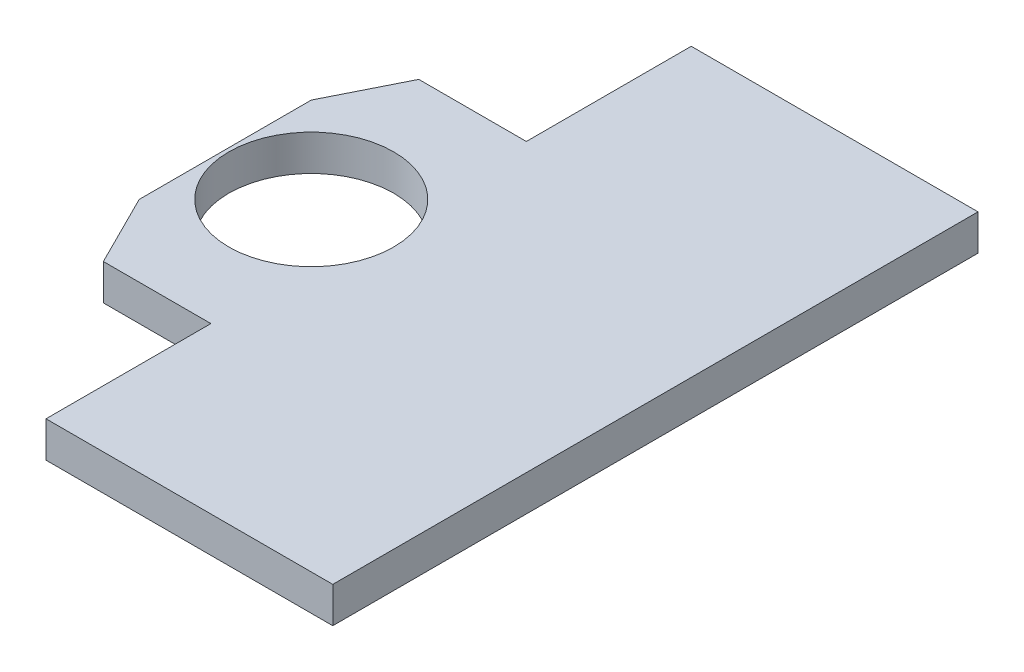
ISO-10303-21;
HEADER;
FILE_DESCRIPTION(('STEP AP214'),'2;1');
FILE_NAME('part.step','',(''),(''),'','','');
FILE_SCHEMA(('AUTOMOTIVE_DESIGN { 1 0 10303 214 1 1 1 1 }'));
ENDSEC;
DATA;
#1=APPLICATION_CONTEXT('core data for automotive mechanical design processes');
#2=APPLICATION_PROTOCOL_DEFINITION('international standard','automotive_design',2000,#1);
#3=PRODUCT_CONTEXT('',#1,'mechanical');
#4=PRODUCT('Part','Part','',(#3));
#5=PRODUCT_RELATED_PRODUCT_CATEGORY('part','',(#4));
#6=PRODUCT_DEFINITION_FORMATION('','',#4);
#7=PRODUCT_DEFINITION_CONTEXT('part definition',#1,'design');
#8=PRODUCT_DEFINITION('design','',#6,#7);
#9=PRODUCT_DEFINITION_SHAPE('','',#8);
#10=(LENGTH_UNIT() NAMED_UNIT(*) SI_UNIT(.MILLI.,.METRE.));
#11=(NAMED_UNIT(*) PLANE_ANGLE_UNIT() SI_UNIT($,.RADIAN.));
#12=(NAMED_UNIT(*) SI_UNIT($,.STERADIAN.) SOLID_ANGLE_UNIT());
#13=UNCERTAINTY_MEASURE_WITH_UNIT(LENGTH_MEASURE(1.E-05),#10,'distance_accuracy_value','');
#14=(GEOMETRIC_REPRESENTATION_CONTEXT(3) GLOBAL_UNCERTAINTY_ASSIGNED_CONTEXT((#13)) GLOBAL_UNIT_ASSIGNED_CONTEXT((#10,
#11,#12)) REPRESENTATION_CONTEXT('',''));
#15=CARTESIAN_POINT('',(0.,0.,0.));
#16=DIRECTION('',(0.,0.,1.));
#17=DIRECTION('',(1.,0.,0.));
#18=AXIS2_PLACEMENT_3D('',#15,#16,#17);
#19=CARTESIAN_POINT('',(0.,6.35,0.));
#20=DIRECTION('',(0.,1.,0.));
#21=DIRECTION('',(0.,0.,1.));
#22=AXIS2_PLACEMENT_3D('',#19,#20,#21);
#23=PLANE('',#22);
#24=DIRECTION('',(0.447213595499958,0.,-0.894427190999916));
#25=VECTOR('',#24,1.);
#26=CARTESIAN_POINT('',(-38.1,6.35,-15.24));
#27=LINE('',#26,#25);
#28=CARTESIAN_POINT('',(-38.1,6.35,-15.24));
#29=VERTEX_POINT('',#28);
#30=CARTESIAN_POINT('',(-31.75,6.35,-27.94));
#31=VERTEX_POINT('',#30);
#32=EDGE_CURVE('E48',#29,#31,#27,.T.);
#33=ORIENTED_EDGE('',*,*,#32,.F.);
#34=DIRECTION('',(0.,0.,1.));
#35=VECTOR('',#34,1.);
#36=CARTESIAN_POINT('',(-38.1,6.35,-57.15));
#37=LINE('',#36,#35);
#38=CARTESIAN_POINT('',(-38.1,6.35,15.24));
#39=VERTEX_POINT('',#38);
#40=EDGE_CURVE('E151',#29,#39,#37,.T.);
#41=ORIENTED_EDGE('',*,*,#40,.T.);
#42=DIRECTION('',(-0.447213595499958,0.,-0.894427190999916));
#43=VECTOR('',#42,1.);
#44=CARTESIAN_POINT('',(-31.75,6.35,27.94));
#45=LINE('',#44,#43);
#46=CARTESIAN_POINT('',(-31.75,6.35,27.94));
#47=VERTEX_POINT('',#46);
#48=EDGE_CURVE('E212',#47,#39,#45,.T.);
#49=ORIENTED_EDGE('',*,*,#48,.F.);
#50=DIRECTION('',(-1.,0.,0.));
#51=VECTOR('',#50,1.);
#52=CARTESIAN_POINT('',(-38.1,6.35,27.94));
#53=LINE('',#52,#51);
#54=CARTESIAN_POINT('',(-12.7,6.35,27.94));
#55=VERTEX_POINT('',#54);
#56=EDGE_CURVE('E186',#55,#47,#53,.T.);
#57=ORIENTED_EDGE('',*,*,#56,.F.);
#58=DIRECTION('',(0.,0.,-1.));
#59=VECTOR('',#58,1.);
#60=CARTESIAN_POINT('',(-12.7,6.35,27.94));
#61=LINE('',#60,#59);
#62=CARTESIAN_POINT('',(-12.7,6.35,57.15));
#63=VERTEX_POINT('',#62);
#64=EDGE_CURVE('E180',#63,#55,#61,.T.);
#65=ORIENTED_EDGE('',*,*,#64,.F.);
#66=DIRECTION('',(1.,0.,0.));
#67=VECTOR('',#66,1.);
#68=CARTESIAN_POINT('',(-38.1,6.35,57.15));
#69=LINE('',#68,#67);
#70=CARTESIAN_POINT('',(38.1,6.35,57.15));
#71=VERTEX_POINT('',#70);
#72=EDGE_CURVE('E153',#63,#71,#69,.T.);
#73=ORIENTED_EDGE('',*,*,#72,.T.);
#74=DIRECTION('',(0.,0.,-1.));
#75=VECTOR('',#74,1.);
#76=CARTESIAN_POINT('',(38.1,6.35,-57.15));
#77=LINE('',#76,#75);
#78=CARTESIAN_POINT('',(38.1,6.35,-57.15));
#79=VERTEX_POINT('',#78);
#80=EDGE_CURVE('E144',#71,#79,#77,.T.);
#81=ORIENTED_EDGE('',*,*,#80,.T.);
#82=DIRECTION('',(-1.,0.,0.));
#83=VECTOR('',#82,1.);
#84=CARTESIAN_POINT('',(-38.1,6.35,-57.15));
#85=LINE('',#84,#83);
#86=CARTESIAN_POINT('',(-12.7,6.35,-57.15));
#87=VERTEX_POINT('',#86);
#88=EDGE_CURVE('E147',#79,#87,#85,.T.);
#89=ORIENTED_EDGE('',*,*,#88,.T.);
#90=DIRECTION('',(0.,0.,-1.));
#91=VECTOR('',#90,1.);
#92=CARTESIAN_POINT('',(-12.7,6.35,-57.15));
#93=LINE('',#92,#91);
#94=CARTESIAN_POINT('',(-12.7,6.35,-27.94));
#95=VERTEX_POINT('',#94);
#96=EDGE_CURVE('E197',#95,#87,#93,.T.);
#97=ORIENTED_EDGE('',*,*,#96,.F.);
#98=DIRECTION('',(1.,0.,0.));
#99=VECTOR('',#98,1.);
#100=CARTESIAN_POINT('',(-12.7,6.35,-27.94));
#101=LINE('',#100,#99);
#102=EDGE_CURVE('E195',#31,#95,#101,.T.);
#103=ORIENTED_EDGE('',*,*,#102,.F.);
#104=EDGE_LOOP('',(#33,#41,#49,#57,#65,#73,#81,#89,#97,#103));
#105=FACE_BOUND('',#104,.T.);
#106=CARTESIAN_POINT('',(-22.86,6.35,0.));
#107=DIRECTION('',(0.,1.,0.));
#108=DIRECTION('',(0.,0.,1.));
#109=AXIS2_PLACEMENT_3D('',#106,#107,#108);
#110=CIRCLE('',#109,14.605);
#111=CARTESIAN_POINT('',(-22.86,6.35,14.605));
#112=VERTEX_POINT('',#111);
#113=EDGE_CURVE('E135',#112,#112,#110,.T.);
#114=ORIENTED_EDGE('',*,*,#113,.F.);
#115=EDGE_LOOP('',(#114));
#116=FACE_BOUND('',#115,.T.);
#117=ADVANCED_FACE('F33',(#105,#116),#23,.T.);
#118=CARTESIAN_POINT('',(0.,0.,0.));
#119=DIRECTION('',(0.,1.,0.));
#120=DIRECTION('',(0.,0.,1.));
#121=AXIS2_PLACEMENT_3D('',#118,#119,#120);
#122=PLANE('',#121);
#123=DIRECTION('',(0.,0.,1.));
#124=VECTOR('',#123,1.);
#125=CARTESIAN_POINT('',(-38.1,0.,-57.15));
#126=LINE('',#125,#124);
#127=CARTESIAN_POINT('',(-38.1,0.,-15.24));
#128=VERTEX_POINT('',#127);
#129=CARTESIAN_POINT('',(-38.1,0.,15.24));
#130=VERTEX_POINT('',#129);
#131=EDGE_CURVE('E125',#128,#130,#126,.T.);
#132=ORIENTED_EDGE('',*,*,#131,.F.);
#133=DIRECTION('',(-0.447213595499958,0.,0.894427190999916));
#134=VECTOR('',#133,1.);
#135=CARTESIAN_POINT('',(-38.1,0.,-15.24));
#136=LINE('',#135,#134);
#137=CARTESIAN_POINT('',(-31.75,0.,-27.94));
#138=VERTEX_POINT('',#137);
#139=EDGE_CURVE('E111',#138,#128,#136,.T.);
#140=ORIENTED_EDGE('',*,*,#139,.F.);
#141=DIRECTION('',(-1.,0.,0.));
#142=VECTOR('',#141,1.);
#143=CARTESIAN_POINT('',(-12.7,0.,-27.94));
#144=LINE('',#143,#142);
#145=CARTESIAN_POINT('',(-12.7,0.,-27.94));
#146=VERTEX_POINT('',#145);
#147=EDGE_CURVE('E124',#146,#138,#144,.T.);
#148=ORIENTED_EDGE('',*,*,#147,.F.);
#149=DIRECTION('',(0.,0.,1.));
#150=VECTOR('',#149,1.);
#151=CARTESIAN_POINT('',(-12.7,0.,-57.15));
#152=LINE('',#151,#150);
#153=CARTESIAN_POINT('',(-12.7,0.,-57.15));
#154=VERTEX_POINT('',#153);
#155=EDGE_CURVE('E171',#154,#146,#152,.T.);
#156=ORIENTED_EDGE('',*,*,#155,.F.);
#157=DIRECTION('',(-1.,0.,0.));
#158=VECTOR('',#157,1.);
#159=CARTESIAN_POINT('',(-38.1,0.,-57.15));
#160=LINE('',#159,#158);
#161=CARTESIAN_POINT('',(38.1,0.,-57.15));
#162=VERTEX_POINT('',#161);
#163=EDGE_CURVE('E157',#162,#154,#160,.T.);
#164=ORIENTED_EDGE('',*,*,#163,.F.);
#165=DIRECTION('',(0.,0.,-1.));
#166=VECTOR('',#165,1.);
#167=CARTESIAN_POINT('',(38.1,0.,-57.15));
#168=LINE('',#167,#166);
#169=CARTESIAN_POINT('',(38.1,0.,57.15));
#170=VERTEX_POINT('',#169);
#171=EDGE_CURVE('E142',#170,#162,#168,.T.);
#172=ORIENTED_EDGE('',*,*,#171,.F.);
#173=DIRECTION('',(1.,0.,0.));
#174=VECTOR('',#173,1.);
#175=CARTESIAN_POINT('',(-38.1,0.,57.15));
#176=LINE('',#175,#174);
#177=CARTESIAN_POINT('',(-12.7,0.,57.15));
#178=VERTEX_POINT('',#177);
#179=EDGE_CURVE('E148',#178,#170,#176,.T.);
#180=ORIENTED_EDGE('',*,*,#179,.F.);
#181=DIRECTION('',(0.,0.,1.));
#182=VECTOR('',#181,1.);
#183=CARTESIAN_POINT('',(-12.7,0.,27.94));
#184=LINE('',#183,#182);
#185=CARTESIAN_POINT('',(-12.7,0.,27.94));
#186=VERTEX_POINT('',#185);
#187=EDGE_CURVE('E188',#186,#178,#184,.T.);
#188=ORIENTED_EDGE('',*,*,#187,.F.);
#189=DIRECTION('',(1.,0.,0.));
#190=VECTOR('',#189,1.);
#191=CARTESIAN_POINT('',(-38.1,0.,27.94));
#192=LINE('',#191,#190);
#193=CARTESIAN_POINT('',(-31.75,0.,27.94));
#194=VERTEX_POINT('',#193);
#195=EDGE_CURVE('E210',#194,#186,#192,.T.);
#196=ORIENTED_EDGE('',*,*,#195,.F.);
#197=DIRECTION('',(0.447213595499958,0.,0.894427190999916));
#198=VECTOR('',#197,1.);
#199=CARTESIAN_POINT('',(-31.75,0.,27.94));
#200=LINE('',#199,#198);
#201=EDGE_CURVE('E56',#130,#194,#200,.T.);
#202=ORIENTED_EDGE('',*,*,#201,.F.);
#203=EDGE_LOOP('',(#132,#140,#148,#156,#164,#172,#180,#188,#196,#202));
#204=FACE_BOUND('',#203,.T.);
#205=CARTESIAN_POINT('',(-22.86,0.,0.));
#206=DIRECTION('',(0.,1.,0.));
#207=DIRECTION('',(0.,0.,1.));
#208=AXIS2_PLACEMENT_3D('',#205,#206,#207);
#209=CIRCLE('',#208,14.605);
#210=CARTESIAN_POINT('',(-22.86,0.,14.605));
#211=VERTEX_POINT('',#210);
#212=EDGE_CURVE('E131',#211,#211,#209,.T.);
#213=ORIENTED_EDGE('',*,*,#212,.T.);
#214=EDGE_LOOP('',(#213));
#215=FACE_BOUND('',#214,.T.);
#216=ADVANCED_FACE('F121',(#204,#215),#122,.F.);
#217=CARTESIAN_POINT('',(38.1,6.35,-57.15));
#218=DIRECTION('',(-1.,0.,0.));
#219=DIRECTION('',(0.,0.,1.));
#220=AXIS2_PLACEMENT_3D('',#217,#218,#219);
#221=PLANE('',#220);
#222=ORIENTED_EDGE('',*,*,#171,.T.);
#223=DIRECTION('',(0.,-1.,0.));
#224=VECTOR('',#223,1.);
#225=CARTESIAN_POINT('',(38.1,6.35,-57.15));
#226=LINE('',#225,#224);
#227=EDGE_CURVE('E11',#79,#162,#226,.T.);
#228=ORIENTED_EDGE('',*,*,#227,.F.);
#229=ORIENTED_EDGE('',*,*,#80,.F.);
#230=DIRECTION('',(0.,-1.,0.));
#231=VECTOR('',#230,1.);
#232=CARTESIAN_POINT('',(38.1,6.35,57.15));
#233=LINE('',#232,#231);
#234=EDGE_CURVE('E41',#71,#170,#233,.T.);
#235=ORIENTED_EDGE('',*,*,#234,.T.);
#236=EDGE_LOOP('',(#222,#228,#229,#235));
#237=FACE_BOUND('',#236,.T.);
#238=ADVANCED_FACE('F35',(#237),#221,.F.);
#239=CARTESIAN_POINT('',(-38.1,6.35,-57.15));
#240=DIRECTION('',(0.,0.,1.));
#241=DIRECTION('',(1.,0.,0.));
#242=AXIS2_PLACEMENT_3D('',#239,#240,#241);
#243=PLANE('',#242);
#244=ORIENTED_EDGE('',*,*,#163,.T.);
#245=DIRECTION('',(0.,1.,0.));
#246=VECTOR('',#245,1.);
#247=CARTESIAN_POINT('',(-12.7,-0.00100000000000013,-57.15));
#248=LINE('',#247,#246);
#249=EDGE_CURVE('E132',#154,#87,#248,.T.);
#250=ORIENTED_EDGE('',*,*,#249,.T.);
#251=ORIENTED_EDGE('',*,*,#88,.F.);
#252=ORIENTED_EDGE('',*,*,#227,.T.);
#253=EDGE_LOOP('',(#244,#250,#251,#252));
#254=FACE_BOUND('',#253,.T.);
#255=ADVANCED_FACE('F173',(#254),#243,.F.);
#256=CARTESIAN_POINT('',(-38.1,6.35,-57.15));
#257=DIRECTION('',(1.,0.,0.));
#258=DIRECTION('',(0.,0.,-1.));
#259=AXIS2_PLACEMENT_3D('',#256,#257,#258);
#260=PLANE('',#259);
#261=ORIENTED_EDGE('',*,*,#40,.F.);
#262=DIRECTION('',(0.,1.,0.));
#263=VECTOR('',#262,1.);
#264=CARTESIAN_POINT('',(-38.1,-0.00100000000000013,-15.24));
#265=LINE('',#264,#263);
#266=EDGE_CURVE('E116',#128,#29,#265,.T.);
#267=ORIENTED_EDGE('',*,*,#266,.F.);
#268=ORIENTED_EDGE('',*,*,#131,.T.);
#269=DIRECTION('',(0.,1.,0.));
#270=VECTOR('',#269,1.);
#271=CARTESIAN_POINT('',(-38.1,-0.00100000000000013,15.24));
#272=LINE('',#271,#270);
#273=EDGE_CURVE('E207',#130,#39,#272,.T.);
#274=ORIENTED_EDGE('',*,*,#273,.T.);
#275=EDGE_LOOP('',(#261,#267,#268,#274));
#276=FACE_BOUND('',#275,.T.);
#277=ADVANCED_FACE('F206',(#276),#260,.F.);
#278=CARTESIAN_POINT('',(-38.1,6.35,57.15));
#279=DIRECTION('',(0.,0.,-1.));
#280=DIRECTION('',(-1.,0.,0.));
#281=AXIS2_PLACEMENT_3D('',#278,#279,#280);
#282=PLANE('',#281);
#283=ORIENTED_EDGE('',*,*,#72,.F.);
#284=DIRECTION('',(0.,1.,0.));
#285=VECTOR('',#284,1.);
#286=CARTESIAN_POINT('',(-12.7,-0.00100000000000013,57.15));
#287=LINE('',#286,#285);
#288=EDGE_CURVE('E183',#178,#63,#287,.T.);
#289=ORIENTED_EDGE('',*,*,#288,.F.);
#290=ORIENTED_EDGE('',*,*,#179,.T.);
#291=ORIENTED_EDGE('',*,*,#234,.F.);
#292=EDGE_LOOP('',(#283,#289,#290,#291));
#293=FACE_BOUND('',#292,.T.);
#294=ADVANCED_FACE('F182',(#293),#282,.F.);
#295=CARTESIAN_POINT('',(-22.86,6.35,0.));
#296=DIRECTION('',(0.,-1.,0.));
#297=DIRECTION('',(0.,0.,-1.));
#298=AXIS2_PLACEMENT_3D('',#295,#296,#297);
#299=CYLINDRICAL_SURFACE('',#298,14.605);
#300=ORIENTED_EDGE('',*,*,#113,.T.);
#301=EDGE_LOOP('',(#300));
#302=FACE_BOUND('',#301,.T.);
#303=ORIENTED_EDGE('',*,*,#212,.F.);
#304=EDGE_LOOP('',(#303));
#305=FACE_BOUND('',#304,.T.);
#306=ADVANCED_FACE('F240',(#302,#305),#299,.F.);
#307=CARTESIAN_POINT('',(-12.7,-0.00100000000000013,-57.15));
#308=DIRECTION('',(1.,0.,0.));
#309=DIRECTION('',(0.,0.,-1.));
#310=AXIS2_PLACEMENT_3D('',#307,#308,#309);
#311=PLANE('',#310);
#312=ORIENTED_EDGE('',*,*,#155,.T.);
#313=DIRECTION('',(0.,1.,0.));
#314=VECTOR('',#313,1.);
#315=CARTESIAN_POINT('',(-12.7,-0.00100000000000013,-27.94));
#316=LINE('',#315,#314);
#317=EDGE_CURVE('E129',#146,#95,#316,.T.);
#318=ORIENTED_EDGE('',*,*,#317,.T.);
#319=ORIENTED_EDGE('',*,*,#96,.T.);
#320=ORIENTED_EDGE('',*,*,#249,.F.);
#321=EDGE_LOOP('',(#312,#318,#319,#320));
#322=FACE_BOUND('',#321,.T.);
#323=ADVANCED_FACE('F199',(#322),#311,.F.);
#324=CARTESIAN_POINT('',(-12.7,-0.00100000000000013,-27.94));
#325=DIRECTION('',(0.,0.,1.));
#326=DIRECTION('',(1.,0.,0.));
#327=AXIS2_PLACEMENT_3D('',#324,#325,#326);
#328=PLANE('',#327);
#329=ORIENTED_EDGE('',*,*,#147,.T.);
#330=DIRECTION('',(0.,1.,0.));
#331=VECTOR('',#330,1.);
#332=CARTESIAN_POINT('',(-31.75,-0.00100000000000013,-27.94));
#333=LINE('',#332,#331);
#334=EDGE_CURVE('E108',#138,#31,#333,.T.);
#335=ORIENTED_EDGE('',*,*,#334,.T.);
#336=ORIENTED_EDGE('',*,*,#102,.T.);
#337=ORIENTED_EDGE('',*,*,#317,.F.);
#338=EDGE_LOOP('',(#329,#335,#336,#337));
#339=FACE_BOUND('',#338,.T.);
#340=ADVANCED_FACE('F127',(#339),#328,.F.);
#341=CARTESIAN_POINT('',(-38.1,-0.00100000000000013,27.94));
#342=DIRECTION('',(0.,0.,-1.));
#343=DIRECTION('',(-1.,0.,0.));
#344=AXIS2_PLACEMENT_3D('',#341,#342,#343);
#345=PLANE('',#344);
#346=ORIENTED_EDGE('',*,*,#56,.T.);
#347=DIRECTION('',(0.,1.,0.));
#348=VECTOR('',#347,1.);
#349=CARTESIAN_POINT('',(-31.75,-0.00100000000000013,27.94));
#350=LINE('',#349,#348);
#351=EDGE_CURVE('E208',#194,#47,#350,.T.);
#352=ORIENTED_EDGE('',*,*,#351,.F.);
#353=ORIENTED_EDGE('',*,*,#195,.T.);
#354=DIRECTION('',(0.,1.,0.));
#355=VECTOR('',#354,1.);
#356=CARTESIAN_POINT('',(-12.7,-0.00100000000000013,27.94));
#357=LINE('',#356,#355);
#358=EDGE_CURVE('E185',#186,#55,#357,.T.);
#359=ORIENTED_EDGE('',*,*,#358,.T.);
#360=EDGE_LOOP('',(#346,#352,#353,#359));
#361=FACE_BOUND('',#360,.T.);
#362=ADVANCED_FACE('F220',(#361),#345,.F.);
#363=CARTESIAN_POINT('',(-12.7,-0.00100000000000013,27.94));
#364=DIRECTION('',(1.,0.,0.));
#365=DIRECTION('',(0.,0.,-1.));
#366=AXIS2_PLACEMENT_3D('',#363,#364,#365);
#367=PLANE('',#366);
#368=ORIENTED_EDGE('',*,*,#187,.T.);
#369=ORIENTED_EDGE('',*,*,#288,.T.);
#370=ORIENTED_EDGE('',*,*,#64,.T.);
#371=ORIENTED_EDGE('',*,*,#358,.F.);
#372=EDGE_LOOP('',(#368,#369,#370,#371));
#373=FACE_BOUND('',#372,.T.);
#374=ADVANCED_FACE('F218',(#373),#367,.F.);
#375=CARTESIAN_POINT('',(-31.75,-0.00100000000000013,27.94));
#376=DIRECTION('',(0.894427190999916,0.,-0.447213595499958));
#377=DIRECTION('',(-0.447213595499958,0.,-0.894427190999916));
#378=AXIS2_PLACEMENT_3D('',#375,#376,#377);
#379=PLANE('',#378);
#380=ORIENTED_EDGE('',*,*,#201,.T.);
#381=ORIENTED_EDGE('',*,*,#351,.T.);
#382=ORIENTED_EDGE('',*,*,#48,.T.);
#383=ORIENTED_EDGE('',*,*,#273,.F.);
#384=EDGE_LOOP('',(#380,#381,#382,#383));
#385=FACE_BOUND('',#384,.T.);
#386=ADVANCED_FACE('F222',(#385),#379,.F.);
#387=CARTESIAN_POINT('',(-38.1,-0.00100000000000013,-15.24));
#388=DIRECTION('',(0.894427190999916,0.,0.447213595499958));
#389=DIRECTION('',(0.447213595499958,0.,-0.894427190999916));
#390=AXIS2_PLACEMENT_3D('',#387,#388,#389);
#391=PLANE('',#390);
#392=ORIENTED_EDGE('',*,*,#139,.T.);
#393=ORIENTED_EDGE('',*,*,#266,.T.);
#394=ORIENTED_EDGE('',*,*,#32,.T.);
#395=ORIENTED_EDGE('',*,*,#334,.F.);
#396=EDGE_LOOP('',(#392,#393,#394,#395));
#397=FACE_BOUND('',#396,.T.);
#398=ADVANCED_FACE('F110',(#397),#391,.F.);
#399=CLOSED_SHELL('',(#117,#216,#238,#255,#277,#294,#306,#323,#340,#362,#374,#386,#398));
#400=MANIFOLD_SOLID_BREP('B2',#399);
#401=ADVANCED_BREP_SHAPE_REPRESENTATION('',(#18,#400),#14);
#402=SHAPE_DEFINITION_REPRESENTATION(#9,#401);
ENDSEC;
END-ISO-10303-21;
